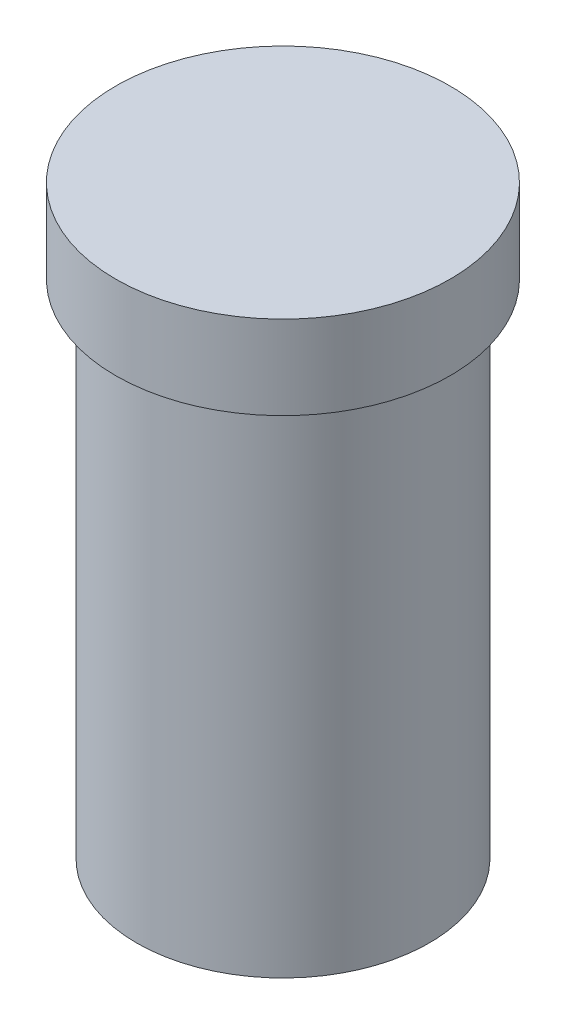
ISO-10303-21;
HEADER;
FILE_DESCRIPTION(('STEP AP214'),'2;1');
FILE_NAME('part.step','',(''),(''),'','','');
FILE_SCHEMA(('AUTOMOTIVE_DESIGN { 1 0 10303 214 1 1 1 1 }'));
ENDSEC;
DATA;
#1=APPLICATION_CONTEXT('core data for automotive mechanical design processes');
#2=APPLICATION_PROTOCOL_DEFINITION('international standard','automotive_design',2000,#1);
#3=PRODUCT_CONTEXT('',#1,'mechanical');
#4=PRODUCT('Part','Part','',(#3));
#5=PRODUCT_RELATED_PRODUCT_CATEGORY('part','',(#4));
#6=PRODUCT_DEFINITION_FORMATION('','',#4);
#7=PRODUCT_DEFINITION_CONTEXT('part definition',#1,'design');
#8=PRODUCT_DEFINITION('design','',#6,#7);
#9=PRODUCT_DEFINITION_SHAPE('','',#8);
#10=(LENGTH_UNIT() NAMED_UNIT(*) SI_UNIT(.MILLI.,.METRE.));
#11=(NAMED_UNIT(*) PLANE_ANGLE_UNIT() SI_UNIT($,.RADIAN.));
#12=(NAMED_UNIT(*) SI_UNIT($,.STERADIAN.) SOLID_ANGLE_UNIT());
#13=UNCERTAINTY_MEASURE_WITH_UNIT(LENGTH_MEASURE(1.E-05),#10,'distance_accuracy_value','');
#14=(GEOMETRIC_REPRESENTATION_CONTEXT(3) GLOBAL_UNCERTAINTY_ASSIGNED_CONTEXT((#13)) GLOBAL_UNIT_ASSIGNED_CONTEXT((#10,
#11,#12)) REPRESENTATION_CONTEXT('',''));
#15=CARTESIAN_POINT('',(0.,0.,0.));
#16=DIRECTION('',(0.,0.,1.));
#17=DIRECTION('',(1.,0.,0.));
#18=AXIS2_PLACEMENT_3D('',#15,#16,#17);
#19=CARTESIAN_POINT('',(0.,-6.,0.));
#20=DIRECTION('',(0.,1.,0.));
#21=DIRECTION('',(0.,0.,1.));
#22=AXIS2_PLACEMENT_3D('',#19,#20,#21);
#23=CYLINDRICAL_SURFACE('',#22,1.75);
#24=CARTESIAN_POINT('',(0.,-6.,0.));
#25=DIRECTION('',(0.,1.,0.));
#26=DIRECTION('',(0.,0.,1.));
#27=AXIS2_PLACEMENT_3D('',#24,#25,#26);
#28=CIRCLE('',#27,1.75);
#29=CARTESIAN_POINT('',(0.,-6.,1.75));
#30=VERTEX_POINT('',#29);
#31=EDGE_CURVE('E10',#30,#30,#28,.T.);
#32=ORIENTED_EDGE('',*,*,#31,.T.);
#33=EDGE_LOOP('',(#32));
#34=FACE_BOUND('',#33,.T.);
#35=CARTESIAN_POINT('',(0.,0.,0.));
#36=DIRECTION('',(0.,1.,0.));
#37=DIRECTION('',(0.,0.,1.));
#38=AXIS2_PLACEMENT_3D('',#35,#36,#37);
#39=CIRCLE('',#38,1.75);
#40=CARTESIAN_POINT('',(0.,0.,1.75));
#41=VERTEX_POINT('',#40);
#42=EDGE_CURVE('E40',#41,#41,#39,.T.);
#43=ORIENTED_EDGE('',*,*,#42,.F.);
#44=EDGE_LOOP('',(#43));
#45=FACE_BOUND('',#44,.T.);
#46=ADVANCED_FACE('F37',(#34,#45),#23,.T.);
#47=CARTESIAN_POINT('',(0.,-6.,0.));
#48=DIRECTION('',(0.,1.,0.));
#49=DIRECTION('',(0.,0.,1.));
#50=AXIS2_PLACEMENT_3D('',#47,#48,#49);
#51=PLANE('',#50);
#52=ORIENTED_EDGE('',*,*,#31,.F.);
#53=EDGE_LOOP('',(#52));
#54=FACE_BOUND('',#53,.T.);
#55=ADVANCED_FACE('F60',(#54),#51,.F.);
#56=CARTESIAN_POINT('',(0.,1.,0.));
#57=DIRECTION('',(0.,-1.,0.));
#58=DIRECTION('',(0.,0.,-1.));
#59=AXIS2_PLACEMENT_3D('',#56,#57,#58);
#60=CYLINDRICAL_SURFACE('',#59,2.);
#61=CARTESIAN_POINT('',(0.,1.,0.));
#62=DIRECTION('',(0.,1.,0.));
#63=DIRECTION('',(0.,0.,1.));
#64=AXIS2_PLACEMENT_3D('',#61,#62,#63);
#65=CIRCLE('',#64,2.);
#66=CARTESIAN_POINT('',(0.,1.,2.));
#67=VERTEX_POINT('',#66);
#68=EDGE_CURVE('E47',#67,#67,#65,.T.);
#69=ORIENTED_EDGE('',*,*,#68,.F.);
#70=EDGE_LOOP('',(#69));
#71=FACE_BOUND('',#70,.T.);
#72=CARTESIAN_POINT('',(0.,0.,0.));
#73=DIRECTION('',(0.,1.,0.));
#74=DIRECTION('',(0.,0.,1.));
#75=AXIS2_PLACEMENT_3D('',#72,#73,#74);
#76=CIRCLE('',#75,2.);
#77=CARTESIAN_POINT('',(0.,0.,2.));
#78=VERTEX_POINT('',#77);
#79=EDGE_CURVE('E49',#78,#78,#76,.T.);
#80=ORIENTED_EDGE('',*,*,#79,.T.);
#81=EDGE_LOOP('',(#80));
#82=FACE_BOUND('',#81,.T.);
#83=ADVANCED_FACE('F57',(#71,#82),#60,.T.);
#84=CARTESIAN_POINT('',(0.,1.,0.));
#85=DIRECTION('',(0.,1.,0.));
#86=DIRECTION('',(0.,0.,1.));
#87=AXIS2_PLACEMENT_3D('',#84,#85,#86);
#88=PLANE('',#87);
#89=ORIENTED_EDGE('',*,*,#68,.T.);
#90=EDGE_LOOP('',(#89));
#91=FACE_BOUND('',#90,.T.);
#92=ADVANCED_FACE('F55',(#91),#88,.T.);
#93=CARTESIAN_POINT('',(0.,0.,0.));
#94=DIRECTION('',(0.,1.,0.));
#95=DIRECTION('',(0.,0.,1.));
#96=AXIS2_PLACEMENT_3D('',#93,#94,#95);
#97=PLANE('',#96);
#98=ORIENTED_EDGE('',*,*,#42,.T.);
#99=EDGE_LOOP('',(#98));
#100=FACE_BOUND('',#99,.T.);
#101=ORIENTED_EDGE('',*,*,#79,.F.);
#102=EDGE_LOOP('',(#101));
#103=FACE_BOUND('',#102,.T.);
#104=ADVANCED_FACE('F64',(#100,#103),#97,.F.);
#105=CLOSED_SHELL('',(#46,#55,#83,#92,#104));
#106=MANIFOLD_SOLID_BREP('B2',#105);
#107=ADVANCED_BREP_SHAPE_REPRESENTATION('',(#18,#106),#14);
#108=SHAPE_DEFINITION_REPRESENTATION(#9,#107);
ENDSEC;
END-ISO-10303-21;
